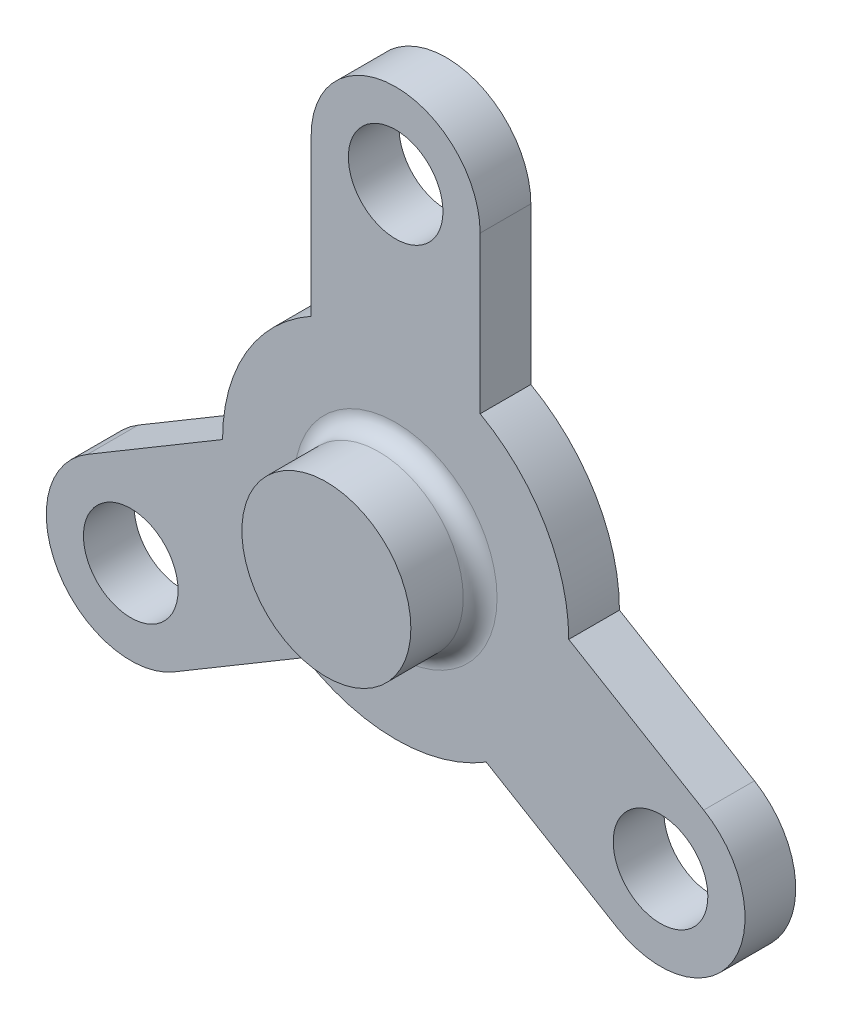
ISO-10303-21;
HEADER;
FILE_DESCRIPTION(('STEP AP214'),'2;1');
FILE_NAME('part.step','',(''),(''),'','','');
FILE_SCHEMA(('AUTOMOTIVE_DESIGN { 1 0 10303 214 1 1 1 1 }'));
ENDSEC;
DATA;
#1=APPLICATION_CONTEXT('core data for automotive mechanical design processes');
#2=APPLICATION_PROTOCOL_DEFINITION('international standard','automotive_design',2000,#1);
#3=PRODUCT_CONTEXT('',#1,'mechanical');
#4=PRODUCT('Part','Part','',(#3));
#5=PRODUCT_RELATED_PRODUCT_CATEGORY('part','',(#4));
#6=PRODUCT_DEFINITION_FORMATION('','',#4);
#7=PRODUCT_DEFINITION_CONTEXT('part definition',#1,'design');
#8=PRODUCT_DEFINITION('design','',#6,#7);
#9=PRODUCT_DEFINITION_SHAPE('','',#8);
#10=(LENGTH_UNIT() NAMED_UNIT(*) SI_UNIT(.MILLI.,.METRE.));
#11=(NAMED_UNIT(*) PLANE_ANGLE_UNIT() SI_UNIT($,.RADIAN.));
#12=(NAMED_UNIT(*) SI_UNIT($,.STERADIAN.) SOLID_ANGLE_UNIT());
#13=UNCERTAINTY_MEASURE_WITH_UNIT(LENGTH_MEASURE(1.E-05),#10,'distance_accuracy_value','');
#14=(GEOMETRIC_REPRESENTATION_CONTEXT(3) GLOBAL_UNCERTAINTY_ASSIGNED_CONTEXT((#13)) GLOBAL_UNIT_ASSIGNED_CONTEXT((#10,
#11,#12)) REPRESENTATION_CONTEXT('',''));
#15=CARTESIAN_POINT('',(0.,0.,0.));
#16=DIRECTION('',(0.,0.,1.));
#17=DIRECTION('',(1.,0.,0.));
#18=AXIS2_PLACEMENT_3D('',#15,#16,#17);
#19=CARTESIAN_POINT('',(-15.6750598084983,-9.05000000000008,3.));
#20=DIRECTION('',(0.,0.,-1.));
#21=DIRECTION('',(-1.,0.,0.));
#22=AXIS2_PLACEMENT_3D('',#19,#20,#21);
#23=CYLINDRICAL_SURFACE('',#22,5.);
#24=CARTESIAN_POINT('',(-15.6750598084983,-9.05000000000008,0.));
#25=DIRECTION('',(0.,0.,1.));
#26=DIRECTION('',(1.,0.,0.));
#27=AXIS2_PLACEMENT_3D('',#24,#25,#26);
#28=CIRCLE('',#27,5.);
#29=CARTESIAN_POINT('',(-18.2317713929619,-4.75311439832654,0.));
#30=VERTEX_POINT('',#29);
#31=CARTESIAN_POINT('',(-13.1183482240346,-13.3468856016736,0.));
#32=VERTEX_POINT('',#31);
#33=EDGE_CURVE('E198',#30,#32,#28,.T.);
#34=ORIENTED_EDGE('',*,*,#33,.T.);
#35=DIRECTION('',(0.,0.,-1.));
#36=VECTOR('',#35,1.);
#37=CARTESIAN_POINT('',(-13.1183482240346,-13.3468856016736,3.));
#38=LINE('',#37,#36);
#39=CARTESIAN_POINT('',(-13.1183482240346,-13.3468856016736,3.));
#40=VERTEX_POINT('',#39);
#41=EDGE_CURVE('E235',#40,#32,#38,.T.);
#42=ORIENTED_EDGE('',*,*,#41,.F.);
#43=CARTESIAN_POINT('',(-15.6750598084983,-9.05000000000008,3.));
#44=DIRECTION('',(0.,0.,1.));
#45=DIRECTION('',(1.,0.,0.));
#46=AXIS2_PLACEMENT_3D('',#43,#44,#45);
#47=CIRCLE('',#46,5.);
#48=CARTESIAN_POINT('',(-18.2317713929619,-4.75311439832654,3.));
#49=VERTEX_POINT('',#48);
#50=EDGE_CURVE('E310',#49,#40,#47,.T.);
#51=ORIENTED_EDGE('',*,*,#50,.F.);
#52=DIRECTION('',(0.,0.,-1.));
#53=VECTOR('',#52,1.);
#54=CARTESIAN_POINT('',(-18.2317713929619,-4.75311439832654,3.));
#55=LINE('',#54,#53);
#56=EDGE_CURVE('E144',#49,#30,#55,.T.);
#57=ORIENTED_EDGE('',*,*,#56,.T.);
#58=EDGE_LOOP('',(#34,#42,#51,#57));
#59=FACE_BOUND('',#58,.T.);
#60=ADVANCED_FACE('F74',(#59),#23,.T.);
#61=CARTESIAN_POINT('',(2.43503335375282,-4.09238954480285,3.));
#62=DIRECTION('',(-0.511342316892728,0.859377120334709,0.));
#63=DIRECTION('',(-0.859377120334709,-0.511342316892728,0.));
#64=AXIS2_PLACEMENT_3D('',#61,#62,#63);
#65=PLANE('',#64);
#66=DIRECTION('',(0.859377120334709,0.511342316892728,0.));
#67=VECTOR('',#66,1.);
#68=CARTESIAN_POINT('',(2.43503335375282,-4.09238954480285,0.));
#69=LINE('',#68,#67);
#70=CARTESIAN_POINT('',(-5.35896242928677,-8.72993430512808,0.));
#71=VERTEX_POINT('',#70);
#72=EDGE_CURVE('E201',#32,#71,#69,.T.);
#73=ORIENTED_EDGE('',*,*,#72,.T.);
#74=DIRECTION('',(0.,0.,-1.));
#75=VECTOR('',#74,1.);
#76=CARTESIAN_POINT('',(-5.35896242928677,-8.72993430512808,3.));
#77=LINE('',#76,#75);
#78=CARTESIAN_POINT('',(-5.35896242928677,-8.72993430512808,3.));
#79=VERTEX_POINT('',#78);
#80=EDGE_CURVE('E232',#79,#71,#77,.T.);
#81=ORIENTED_EDGE('',*,*,#80,.F.);
#82=DIRECTION('',(0.859377120334709,0.511342316892728,0.));
#83=VECTOR('',#82,1.);
#84=CARTESIAN_POINT('',(2.43503335375282,-4.09238954480285,3.));
#85=LINE('',#84,#83);
#86=EDGE_CURVE('E309',#40,#79,#85,.T.);
#87=ORIENTED_EDGE('',*,*,#86,.F.);
#88=ORIENTED_EDGE('',*,*,#41,.T.);
#89=EDGE_LOOP('',(#73,#81,#87,#88));
#90=FACE_BOUND('',#89,.T.);
#91=ADVANCED_FACE('F260',(#90),#65,.F.);
#92=CARTESIAN_POINT('',(0.,0.,3.));
#93=DIRECTION('',(0.,0.,-1.));
#94=DIRECTION('',(-1.,0.,0.));
#95=AXIS2_PLACEMENT_3D('',#92,#93,#94);
#96=CYLINDRICAL_SURFACE('',#95,10.2435458358109);
#97=CARTESIAN_POINT('',(0.,0.,0.));
#98=DIRECTION('',(0.,0.,1.));
#99=DIRECTION('',(1.,0.,0.));
#100=AXIS2_PLACEMENT_3D('',#97,#98,#99);
#101=CIRCLE('',#100,10.2435458358109);
#102=CARTESIAN_POINT('',(5.35896242928677,-8.72993430512809,0.));
#103=VERTEX_POINT('',#102);
#104=EDGE_CURVE('E203',#71,#103,#101,.T.);
#105=ORIENTED_EDGE('',*,*,#104,.T.);
#106=DIRECTION('',(0.,0.,-1.));
#107=VECTOR('',#106,1.);
#108=CARTESIAN_POINT('',(5.35896242928677,-8.72993430512809,3.));
#109=LINE('',#108,#107);
#110=CARTESIAN_POINT('',(5.35896242928677,-8.72993430512809,3.));
#111=VERTEX_POINT('',#110);
#112=EDGE_CURVE('E230',#111,#103,#109,.T.);
#113=ORIENTED_EDGE('',*,*,#112,.F.);
#114=CARTESIAN_POINT('',(0.,0.,3.));
#115=DIRECTION('',(0.,0.,1.));
#116=DIRECTION('',(1.,0.,0.));
#117=AXIS2_PLACEMENT_3D('',#114,#115,#116);
#118=CIRCLE('',#117,10.2435458358109);
#119=EDGE_CURVE('E192',#79,#111,#118,.T.);
#120=ORIENTED_EDGE('',*,*,#119,.F.);
#121=ORIENTED_EDGE('',*,*,#80,.T.);
#122=EDGE_LOOP('',(#105,#113,#120,#121));
#123=FACE_BOUND('',#122,.T.);
#124=ADVANCED_FACE('F266',(#123),#96,.T.);
#125=CARTESIAN_POINT('',(-2.43503335375282,-4.09238954480286,3.));
#126=DIRECTION('',(-0.511342316892728,-0.859377120334709,0.));
#127=DIRECTION('',(0.859377120334709,-0.511342316892728,0.));
#128=AXIS2_PLACEMENT_3D('',#125,#126,#127);
#129=PLANE('',#128);
#130=DIRECTION('',(-0.859377120334709,0.511342316892728,0.));
#131=VECTOR('',#130,1.);
#132=CARTESIAN_POINT('',(-2.43503335375282,-4.09238954480286,0.));
#133=LINE('',#132,#131);
#134=CARTESIAN_POINT('',(13.1183482240346,-13.3468856016736,0.));
#135=VERTEX_POINT('',#134);
#136=EDGE_CURVE('E206',#135,#103,#133,.T.);
#137=ORIENTED_EDGE('',*,*,#136,.F.);
#138=DIRECTION('',(0.,0.,-1.));
#139=VECTOR('',#138,1.);
#140=CARTESIAN_POINT('',(13.1183482240346,-13.3468856016736,3.));
#141=LINE('',#140,#139);
#142=CARTESIAN_POINT('',(13.1183482240346,-13.3468856016736,3.));
#143=VERTEX_POINT('',#142);
#144=EDGE_CURVE('E228',#143,#135,#141,.T.);
#145=ORIENTED_EDGE('',*,*,#144,.F.);
#146=DIRECTION('',(-0.859377120334709,0.511342316892728,0.));
#147=VECTOR('',#146,1.);
#148=CARTESIAN_POINT('',(-2.43503335375282,-4.09238954480286,3.));
#149=LINE('',#148,#147);
#150=EDGE_CURVE('E301',#143,#111,#149,.T.);
#151=ORIENTED_EDGE('',*,*,#150,.T.);
#152=ORIENTED_EDGE('',*,*,#112,.T.);
#153=EDGE_LOOP('',(#137,#145,#151,#152));
#154=FACE_BOUND('',#153,.T.);
#155=ADVANCED_FACE('F299',(#154),#129,.T.);
#156=CARTESIAN_POINT('',(2.67838981517445,4.50138165854423,3.));
#157=DIRECTION('',(-0.511342316892728,-0.859377120334709,0.));
#158=DIRECTION('',(0.859377120334709,-0.511342316892728,0.));
#159=AXIS2_PLACEMENT_3D('',#156,#157,#158);
#160=PLANE('',#159);
#161=DIRECTION('',(-0.859377120334709,0.511342316892728,0.));
#162=VECTOR('',#161,1.);
#163=CARTESIAN_POINT('',(2.67838981517445,4.50138165854423,0.));
#164=LINE('',#163,#162);
#165=CARTESIAN_POINT('',(18.2317713929619,-4.75311439832654,0.));
#166=VERTEX_POINT('',#165);
#167=CARTESIAN_POINT('',(10.2435458358109,0.,0.));
#168=VERTEX_POINT('',#167);
#169=EDGE_CURVE('E211',#166,#168,#164,.T.);
#170=ORIENTED_EDGE('',*,*,#169,.T.);
#171=DIRECTION('',(0.,0.,-1.));
#172=VECTOR('',#171,1.);
#173=CARTESIAN_POINT('',(10.2435458358109,0.,3.));
#174=LINE('',#173,#172);
#175=CARTESIAN_POINT('',(10.2435458358109,0.,3.));
#176=VERTEX_POINT('',#175);
#177=EDGE_CURVE('E223',#176,#168,#174,.T.);
#178=ORIENTED_EDGE('',*,*,#177,.F.);
#179=DIRECTION('',(-0.859377120334709,0.511342316892728,0.));
#180=VECTOR('',#179,1.);
#181=CARTESIAN_POINT('',(2.67838981517445,4.50138165854423,3.));
#182=LINE('',#181,#180);
#183=CARTESIAN_POINT('',(18.2317713929619,-4.75311439832654,3.));
#184=VERTEX_POINT('',#183);
#185=EDGE_CURVE('E319',#184,#176,#182,.T.);
#186=ORIENTED_EDGE('',*,*,#185,.F.);
#187=DIRECTION('',(0.,0.,-1.));
#188=VECTOR('',#187,1.);
#189=CARTESIAN_POINT('',(18.2317713929619,-4.75311439832654,3.));
#190=LINE('',#189,#188);
#191=EDGE_CURVE('E226',#184,#166,#190,.T.);
#192=ORIENTED_EDGE('',*,*,#191,.T.);
#193=EDGE_LOOP('',(#170,#178,#186,#192));
#194=FACE_BOUND('',#193,.T.);
#195=ADVANCED_FACE('F341',(#194),#160,.F.);
#196=CARTESIAN_POINT('',(5.,8.94037086984423,0.));
#197=VERTEX_POINT('',#196);
#198=EDGE_CURVE('E208',#168,#197,#101,.T.);
#199=ORIENTED_EDGE('',*,*,#198,.T.);
#200=DIRECTION('',(0.,0.,-1.));
#201=VECTOR('',#200,1.);
#202=CARTESIAN_POINT('',(5.,8.94037086984423,3.));
#203=LINE('',#202,#201);
#204=CARTESIAN_POINT('',(5.,8.94037086984423,3.));
#205=VERTEX_POINT('',#204);
#206=EDGE_CURVE('E221',#205,#197,#203,.T.);
#207=ORIENTED_EDGE('',*,*,#206,.F.);
#208=EDGE_CURVE('E191',#176,#205,#118,.T.);
#209=ORIENTED_EDGE('',*,*,#208,.F.);
#210=ORIENTED_EDGE('',*,*,#177,.T.);
#211=EDGE_LOOP('',(#199,#207,#209,#210));
#212=FACE_BOUND('',#211,.T.);
#213=ADVANCED_FACE('F327',(#212),#96,.T.);
#214=CARTESIAN_POINT('',(5.,0.,3.));
#215=DIRECTION('',(1.,0.,0.));
#216=DIRECTION('',(0.,1.,0.));
#217=AXIS2_PLACEMENT_3D('',#214,#215,#216);
#218=PLANE('',#217);
#219=DIRECTION('',(0.,-1.,0.));
#220=VECTOR('',#219,1.);
#221=CARTESIAN_POINT('',(5.,0.,0.));
#222=LINE('',#221,#220);
#223=CARTESIAN_POINT('',(5.,18.2,0.));
#224=VERTEX_POINT('',#223);
#225=EDGE_CURVE('E213',#224,#197,#222,.T.);
#226=ORIENTED_EDGE('',*,*,#225,.F.);
#227=DIRECTION('',(0.,0.,-1.));
#228=VECTOR('',#227,1.);
#229=CARTESIAN_POINT('',(5.,18.2,3.));
#230=LINE('',#229,#228);
#231=CARTESIAN_POINT('',(5.,18.2,3.));
#232=VERTEX_POINT('',#231);
#233=EDGE_CURVE('E185',#232,#224,#230,.T.);
#234=ORIENTED_EDGE('',*,*,#233,.F.);
#235=DIRECTION('',(0.,-1.,0.));
#236=VECTOR('',#235,1.);
#237=CARTESIAN_POINT('',(5.,0.,3.));
#238=LINE('',#237,#236);
#239=EDGE_CURVE('E178',#232,#205,#238,.T.);
#240=ORIENTED_EDGE('',*,*,#239,.T.);
#241=ORIENTED_EDGE('',*,*,#206,.T.);
#242=EDGE_LOOP('',(#226,#234,#240,#241));
#243=FACE_BOUND('',#242,.T.);
#244=ADVANCED_FACE('F329',(#243),#218,.T.);
#245=CARTESIAN_POINT('',(0.,18.2,3.));
#246=DIRECTION('',(0.,0.,-1.));
#247=DIRECTION('',(-1.,0.,0.));
#248=AXIS2_PLACEMENT_3D('',#245,#246,#247);
#249=CYLINDRICAL_SURFACE('',#248,5.);
#250=CARTESIAN_POINT('',(0.,18.2,0.));
#251=DIRECTION('',(0.,0.,1.));
#252=DIRECTION('',(1.,0.,0.));
#253=AXIS2_PLACEMENT_3D('',#250,#251,#252);
#254=CIRCLE('',#253,5.);
#255=CARTESIAN_POINT('',(-5.,18.2,0.));
#256=VERTEX_POINT('',#255);
#257=EDGE_CURVE('E184',#224,#256,#254,.T.);
#258=ORIENTED_EDGE('',*,*,#257,.T.);
#259=DIRECTION('',(0.,0.,-1.));
#260=VECTOR('',#259,1.);
#261=CARTESIAN_POINT('',(-5.,18.2,3.));
#262=LINE('',#261,#260);
#263=CARTESIAN_POINT('',(-5.,18.2,3.));
#264=VERTEX_POINT('',#263);
#265=EDGE_CURVE('E181',#264,#256,#262,.T.);
#266=ORIENTED_EDGE('',*,*,#265,.F.);
#267=CARTESIAN_POINT('',(0.,18.2,3.));
#268=DIRECTION('',(0.,0.,1.));
#269=DIRECTION('',(1.,0.,0.));
#270=AXIS2_PLACEMENT_3D('',#267,#268,#269);
#271=CIRCLE('',#270,5.);
#272=EDGE_CURVE('E172',#232,#264,#271,.T.);
#273=ORIENTED_EDGE('',*,*,#272,.F.);
#274=ORIENTED_EDGE('',*,*,#233,.T.);
#275=EDGE_LOOP('',(#258,#266,#273,#274));
#276=FACE_BOUND('',#275,.T.);
#277=ADVANCED_FACE('F182',(#276),#249,.T.);
#278=CARTESIAN_POINT('',(-5.,0.,3.));
#279=DIRECTION('',(1.,0.,0.));
#280=DIRECTION('',(0.,1.,0.));
#281=AXIS2_PLACEMENT_3D('',#278,#279,#280);
#282=PLANE('',#281);
#283=DIRECTION('',(0.,-1.,0.));
#284=VECTOR('',#283,1.);
#285=CARTESIAN_POINT('',(-5.,0.,0.));
#286=LINE('',#285,#284);
#287=CARTESIAN_POINT('',(-5.,8.94037086984424,0.));
#288=VERTEX_POINT('',#287);
#289=EDGE_CURVE('E132',#256,#288,#286,.T.);
#290=ORIENTED_EDGE('',*,*,#289,.T.);
#291=DIRECTION('',(0.,0.,-1.));
#292=VECTOR('',#291,1.);
#293=CARTESIAN_POINT('',(-5.,8.94037086984424,3.));
#294=LINE('',#293,#292);
#295=CARTESIAN_POINT('',(-5.,8.94037086984424,3.));
#296=VERTEX_POINT('',#295);
#297=EDGE_CURVE('E186',#296,#288,#294,.T.);
#298=ORIENTED_EDGE('',*,*,#297,.F.);
#299=DIRECTION('',(0.,-1.,0.));
#300=VECTOR('',#299,1.);
#301=CARTESIAN_POINT('',(-5.,0.,3.));
#302=LINE('',#301,#300);
#303=EDGE_CURVE('E176',#264,#296,#302,.T.);
#304=ORIENTED_EDGE('',*,*,#303,.F.);
#305=ORIENTED_EDGE('',*,*,#265,.T.);
#306=EDGE_LOOP('',(#290,#298,#304,#305));
#307=FACE_BOUND('',#306,.T.);
#308=ADVANCED_FACE('F188',(#307),#282,.F.);
#309=CARTESIAN_POINT('',(-10.2435458358109,0.,0.));
#310=VERTEX_POINT('',#309);
#311=EDGE_CURVE('E207',#288,#310,#101,.T.);
#312=ORIENTED_EDGE('',*,*,#311,.T.);
#313=DIRECTION('',(0.,0.,-1.));
#314=VECTOR('',#313,1.);
#315=CARTESIAN_POINT('',(-10.2435458358109,0.,3.));
#316=LINE('',#315,#314);
#317=CARTESIAN_POINT('',(-10.2435458358109,0.,3.));
#318=VERTEX_POINT('',#317);
#319=EDGE_CURVE('E139',#318,#310,#316,.T.);
#320=ORIENTED_EDGE('',*,*,#319,.F.);
#321=EDGE_CURVE('E91',#296,#318,#118,.T.);
#322=ORIENTED_EDGE('',*,*,#321,.F.);
#323=ORIENTED_EDGE('',*,*,#297,.T.);
#324=EDGE_LOOP('',(#312,#320,#322,#323));
#325=FACE_BOUND('',#324,.T.);
#326=ADVANCED_FACE('F274',(#325),#96,.T.);
#327=CARTESIAN_POINT('',(-2.67838981517446,4.50138165854424,3.));
#328=DIRECTION('',(-0.511342316892728,0.859377120334709,0.));
#329=DIRECTION('',(-0.859377120334709,-0.511342316892728,0.));
#330=AXIS2_PLACEMENT_3D('',#327,#328,#329);
#331=PLANE('',#330);
#332=DIRECTION('',(0.859377120334709,0.511342316892728,0.));
#333=VECTOR('',#332,1.);
#334=CARTESIAN_POINT('',(-2.67838981517446,4.50138165854424,0.));
#335=LINE('',#334,#333);
#336=EDGE_CURVE('E195',#30,#310,#335,.T.);
#337=ORIENTED_EDGE('',*,*,#336,.F.);
#338=ORIENTED_EDGE('',*,*,#56,.F.);
#339=DIRECTION('',(0.859377120334709,0.511342316892728,0.));
#340=VECTOR('',#339,1.);
#341=CARTESIAN_POINT('',(-2.67838981517446,4.50138165854424,3.));
#342=LINE('',#341,#340);
#343=EDGE_CURVE('E311',#49,#318,#342,.T.);
#344=ORIENTED_EDGE('',*,*,#343,.T.);
#345=ORIENTED_EDGE('',*,*,#319,.T.);
#346=EDGE_LOOP('',(#337,#338,#344,#345));
#347=FACE_BOUND('',#346,.T.);
#348=ADVANCED_FACE('F271',(#347),#331,.T.);
#349=CARTESIAN_POINT('',(0.,0.,0.));
#350=DIRECTION('',(0.,0.,1.));
#351=DIRECTION('',(1.,0.,0.));
#352=AXIS2_PLACEMENT_3D('',#349,#350,#351);
#353=PLANE('',#352);
#354=CARTESIAN_POINT('',(0.,18.2,0.));
#355=DIRECTION('',(0.,0.,1.));
#356=DIRECTION('',(1.,0.,0.));
#357=AXIS2_PLACEMENT_3D('',#354,#355,#356);
#358=CIRCLE('',#357,2.8);
#359=CARTESIAN_POINT('',(2.8,18.2,0.));
#360=VERTEX_POINT('',#359);
#361=EDGE_CURVE('E243',#360,#360,#358,.T.);
#362=ORIENTED_EDGE('',*,*,#361,.T.);
#363=EDGE_LOOP('',(#362));
#364=FACE_BOUND('',#363,.T.);
#365=CARTESIAN_POINT('',(15.6750598084983,-9.05000000000008,0.));
#366=DIRECTION('',(0.,0.,1.));
#367=DIRECTION('',(1.,0.,0.));
#368=AXIS2_PLACEMENT_3D('',#365,#366,#367);
#369=CIRCLE('',#368,2.8);
#370=CARTESIAN_POINT('',(18.4750598084983,-9.05000000000008,0.));
#371=VERTEX_POINT('',#370);
#372=EDGE_CURVE('E459',#371,#371,#369,.T.);
#373=ORIENTED_EDGE('',*,*,#372,.T.);
#374=EDGE_LOOP('',(#373));
#375=FACE_BOUND('',#374,.T.);
#376=CARTESIAN_POINT('',(-15.6750598084983,-9.05000000000008,0.));
#377=DIRECTION('',(0.,0.,1.));
#378=DIRECTION('',(1.,0.,0.));
#379=AXIS2_PLACEMENT_3D('',#376,#377,#378);
#380=CIRCLE('',#379,2.8);
#381=CARTESIAN_POINT('',(-12.8750598084983,-9.05000000000008,0.));
#382=VERTEX_POINT('',#381);
#383=EDGE_CURVE('E461',#382,#382,#380,.T.);
#384=ORIENTED_EDGE('',*,*,#383,.T.);
#385=EDGE_LOOP('',(#384));
#386=FACE_BOUND('',#385,.T.);
#387=ORIENTED_EDGE('',*,*,#336,.T.);
#388=ORIENTED_EDGE('',*,*,#311,.F.);
#389=ORIENTED_EDGE('',*,*,#289,.F.);
#390=ORIENTED_EDGE('',*,*,#257,.F.);
#391=ORIENTED_EDGE('',*,*,#225,.T.);
#392=ORIENTED_EDGE('',*,*,#198,.F.);
#393=ORIENTED_EDGE('',*,*,#169,.F.);
#394=CARTESIAN_POINT('',(15.6750598084983,-9.05000000000008,0.));
#395=DIRECTION('',(0.,0.,1.));
#396=DIRECTION('',(1.,0.,0.));
#397=AXIS2_PLACEMENT_3D('',#394,#395,#396);
#398=CIRCLE('',#397,5.);
#399=EDGE_CURVE('E241',#135,#166,#398,.T.);
#400=ORIENTED_EDGE('',*,*,#399,.F.);
#401=ORIENTED_EDGE('',*,*,#136,.T.);
#402=ORIENTED_EDGE('',*,*,#104,.F.);
#403=ORIENTED_EDGE('',*,*,#72,.F.);
#404=ORIENTED_EDGE('',*,*,#33,.F.);
#405=EDGE_LOOP('',(#387,#388,#389,#390,#391,#392,#393,#400,#401,#402,#403,#404));
#406=FACE_BOUND('',#405,.T.);
#407=ADVANCED_FACE('F273',(#364,#375,#386,#406),#353,.F.);
#408=CARTESIAN_POINT('',(0.,0.,3.));
#409=DIRECTION('',(0.,0.,1.));
#410=DIRECTION('',(1.,0.,0.));
#411=AXIS2_PLACEMENT_3D('',#408,#409,#410);
#412=PLANE('',#411);
#413=CARTESIAN_POINT('',(0.,0.,3.));
#414=DIRECTION('',(0.,0.,1.));
#415=DIRECTION('',(1.,0.,0.));
#416=AXIS2_PLACEMENT_3D('',#413,#414,#415);
#417=CIRCLE('',#416,6.);
#418=CARTESIAN_POINT('',(6.,0.,3.));
#419=VERTEX_POINT('',#418);
#420=EDGE_CURVE('E12',#419,#419,#417,.F.);
#421=ORIENTED_EDGE('',*,*,#420,.T.);
#422=EDGE_LOOP('',(#421));
#423=FACE_BOUND('',#422,.T.);
#424=CARTESIAN_POINT('',(0.,18.2,3.));
#425=DIRECTION('',(0.,0.,1.));
#426=DIRECTION('',(1.,0.,0.));
#427=AXIS2_PLACEMENT_3D('',#424,#425,#426);
#428=CIRCLE('',#427,2.8);
#429=CARTESIAN_POINT('',(2.8,18.2,3.));
#430=VERTEX_POINT('',#429);
#431=EDGE_CURVE('E456',#430,#430,#428,.T.);
#432=ORIENTED_EDGE('',*,*,#431,.F.);
#433=EDGE_LOOP('',(#432));
#434=FACE_BOUND('',#433,.T.);
#435=CARTESIAN_POINT('',(15.6750598084983,-9.05000000000008,3.));
#436=DIRECTION('',(0.,0.,1.));
#437=DIRECTION('',(1.,0.,0.));
#438=AXIS2_PLACEMENT_3D('',#435,#436,#437);
#439=CIRCLE('',#438,2.8);
#440=CARTESIAN_POINT('',(18.4750598084983,-9.05000000000008,3.));
#441=VERTEX_POINT('',#440);
#442=EDGE_CURVE('E470',#441,#441,#439,.T.);
#443=ORIENTED_EDGE('',*,*,#442,.F.);
#444=EDGE_LOOP('',(#443));
#445=FACE_BOUND('',#444,.T.);
#446=CARTESIAN_POINT('',(-15.6750598084983,-9.05000000000008,3.));
#447=DIRECTION('',(0.,0.,1.));
#448=DIRECTION('',(1.,0.,0.));
#449=AXIS2_PLACEMENT_3D('',#446,#447,#448);
#450=CIRCLE('',#449,2.8);
#451=CARTESIAN_POINT('',(-12.8750598084983,-9.05000000000008,3.));
#452=VERTEX_POINT('',#451);
#453=EDGE_CURVE('E467',#452,#452,#450,.T.);
#454=ORIENTED_EDGE('',*,*,#453,.F.);
#455=EDGE_LOOP('',(#454));
#456=FACE_BOUND('',#455,.T.);
#457=ORIENTED_EDGE('',*,*,#343,.F.);
#458=ORIENTED_EDGE('',*,*,#50,.T.);
#459=ORIENTED_EDGE('',*,*,#86,.T.);
#460=ORIENTED_EDGE('',*,*,#119,.T.);
#461=ORIENTED_EDGE('',*,*,#150,.F.);
#462=CARTESIAN_POINT('',(15.6750598084983,-9.05000000000008,3.));
#463=DIRECTION('',(0.,0.,1.));
#464=DIRECTION('',(1.,0.,0.));
#465=AXIS2_PLACEMENT_3D('',#462,#463,#464);
#466=CIRCLE('',#465,5.);
#467=EDGE_CURVE('E199',#143,#184,#466,.T.);
#468=ORIENTED_EDGE('',*,*,#467,.T.);
#469=ORIENTED_EDGE('',*,*,#185,.T.);
#470=ORIENTED_EDGE('',*,*,#208,.T.);
#471=ORIENTED_EDGE('',*,*,#239,.F.);
#472=ORIENTED_EDGE('',*,*,#272,.T.);
#473=ORIENTED_EDGE('',*,*,#303,.T.);
#474=ORIENTED_EDGE('',*,*,#321,.T.);
#475=EDGE_LOOP('',(#457,#458,#459,#460,#461,#468,#469,#470,#471,#472,#473,#474));
#476=FACE_BOUND('',#475,.T.);
#477=ADVANCED_FACE('F174',(#423,#434,#445,#456,#476),#412,.T.);
#478=CARTESIAN_POINT('',(15.6750598084983,-9.05000000000008,3.));
#479=DIRECTION('',(0.,0.,-1.));
#480=DIRECTION('',(-1.,0.,0.));
#481=AXIS2_PLACEMENT_3D('',#478,#479,#480);
#482=CYLINDRICAL_SURFACE('',#481,5.);
#483=ORIENTED_EDGE('',*,*,#144,.T.);
#484=ORIENTED_EDGE('',*,*,#399,.T.);
#485=ORIENTED_EDGE('',*,*,#191,.F.);
#486=ORIENTED_EDGE('',*,*,#467,.F.);
#487=EDGE_LOOP('',(#483,#484,#485,#486));
#488=FACE_BOUND('',#487,.T.);
#489=ADVANCED_FACE('F275',(#488),#482,.T.);
#490=CARTESIAN_POINT('',(-15.6750598084983,-9.05000000000008,-2.5));
#491=DIRECTION('',(0.,0.,1.));
#492=DIRECTION('',(1.,0.,0.));
#493=AXIS2_PLACEMENT_3D('',#490,#491,#492);
#494=CYLINDRICAL_SURFACE('',#493,2.8);
#495=ORIENTED_EDGE('',*,*,#453,.T.);
#496=EDGE_LOOP('',(#495));
#497=FACE_BOUND('',#496,.T.);
#498=ORIENTED_EDGE('',*,*,#383,.F.);
#499=EDGE_LOOP('',(#498));
#500=FACE_BOUND('',#499,.T.);
#501=ADVANCED_FACE('F277',(#497,#500),#494,.F.);
#502=CARTESIAN_POINT('',(15.6750598084983,-9.05000000000008,-2.5));
#503=DIRECTION('',(0.,0.,1.));
#504=DIRECTION('',(1.,0.,0.));
#505=AXIS2_PLACEMENT_3D('',#502,#503,#504);
#506=CYLINDRICAL_SURFACE('',#505,2.8);
#507=ORIENTED_EDGE('',*,*,#442,.T.);
#508=EDGE_LOOP('',(#507));
#509=FACE_BOUND('',#508,.T.);
#510=ORIENTED_EDGE('',*,*,#372,.F.);
#511=EDGE_LOOP('',(#510));
#512=FACE_BOUND('',#511,.T.);
#513=ADVANCED_FACE('F283',(#509,#512),#506,.F.);
#514=CARTESIAN_POINT('',(0.,18.2,-2.5));
#515=DIRECTION('',(0.,0.,1.));
#516=DIRECTION('',(1.,0.,0.));
#517=AXIS2_PLACEMENT_3D('',#514,#515,#516);
#518=CYLINDRICAL_SURFACE('',#517,2.8);
#519=ORIENTED_EDGE('',*,*,#431,.T.);
#520=EDGE_LOOP('',(#519));
#521=FACE_BOUND('',#520,.T.);
#522=ORIENTED_EDGE('',*,*,#361,.F.);
#523=EDGE_LOOP('',(#522));
#524=FACE_BOUND('',#523,.T.);
#525=ADVANCED_FACE('F403',(#521,#524),#518,.F.);
#526=CARTESIAN_POINT('',(0.,0.,7.1));
#527=DIRECTION('',(0.,0.,-1.));
#528=DIRECTION('',(-1.,0.,0.));
#529=AXIS2_PLACEMENT_3D('',#526,#527,#528);
#530=CYLINDRICAL_SURFACE('',#529,5.);
#531=CARTESIAN_POINT('',(0.,0.,4.));
#532=DIRECTION('',(0.,0.,1.));
#533=DIRECTION('',(1.,0.,0.));
#534=AXIS2_PLACEMENT_3D('',#531,#532,#533);
#535=CIRCLE('',#534,5.);
#536=CARTESIAN_POINT('',(5.,0.,4.));
#537=VERTEX_POINT('',#536);
#538=EDGE_CURVE('E83',#537,#537,#535,.T.);
#539=ORIENTED_EDGE('',*,*,#538,.T.);
#540=EDGE_LOOP('',(#539));
#541=FACE_BOUND('',#540,.T.);
#542=CARTESIAN_POINT('',(0.,0.,7.1));
#543=DIRECTION('',(0.,0.,1.));
#544=DIRECTION('',(1.,0.,0.));
#545=AXIS2_PLACEMENT_3D('',#542,#543,#544);
#546=CIRCLE('',#545,5.);
#547=CARTESIAN_POINT('',(5.,0.,7.1));
#548=VERTEX_POINT('',#547);
#549=EDGE_CURVE('E471',#548,#548,#546,.T.);
#550=ORIENTED_EDGE('',*,*,#549,.F.);
#551=EDGE_LOOP('',(#550));
#552=FACE_BOUND('',#551,.T.);
#553=ADVANCED_FACE('F247',(#541,#552),#530,.T.);
#554=CARTESIAN_POINT('',(0.,0.,7.1));
#555=DIRECTION('',(0.,0.,1.));
#556=DIRECTION('',(1.,0.,0.));
#557=AXIS2_PLACEMENT_3D('',#554,#555,#556);
#558=PLANE('',#557);
#559=ORIENTED_EDGE('',*,*,#549,.T.);
#560=EDGE_LOOP('',(#559));
#561=FACE_BOUND('',#560,.T.);
#562=ADVANCED_FACE('F251',(#561),#558,.T.);
#563=CARTESIAN_POINT('',(0.,0.,4.));
#564=DIRECTION('',(0.,0.,1.));
#565=DIRECTION('',(1.,0.,0.));
#566=AXIS2_PLACEMENT_3D('',#563,#564,#565);
#567=TOROIDAL_SURFACE('',#566,6.,1.);
#568=ORIENTED_EDGE('',*,*,#420,.F.);
#569=EDGE_LOOP('',(#568));
#570=FACE_BOUND('',#569,.T.);
#571=ORIENTED_EDGE('',*,*,#538,.F.);
#572=EDGE_LOOP('',(#571));
#573=FACE_BOUND('',#572,.T.);
#574=ADVANCED_FACE('F76',(#570,#573),#567,.F.);
#575=CLOSED_SHELL('',(#60,#91,#124,#155,#195,#213,#244,#277,#308,#326,#348,#407,#477,#489,#501,
#513,#525,#553,#562,#574));
#576=MANIFOLD_SOLID_BREP('B2',#575);
#577=ADVANCED_BREP_SHAPE_REPRESENTATION('',(#18,#576),#14);
#578=SHAPE_DEFINITION_REPRESENTATION(#9,#577);
ENDSEC;
END-ISO-10303-21;
